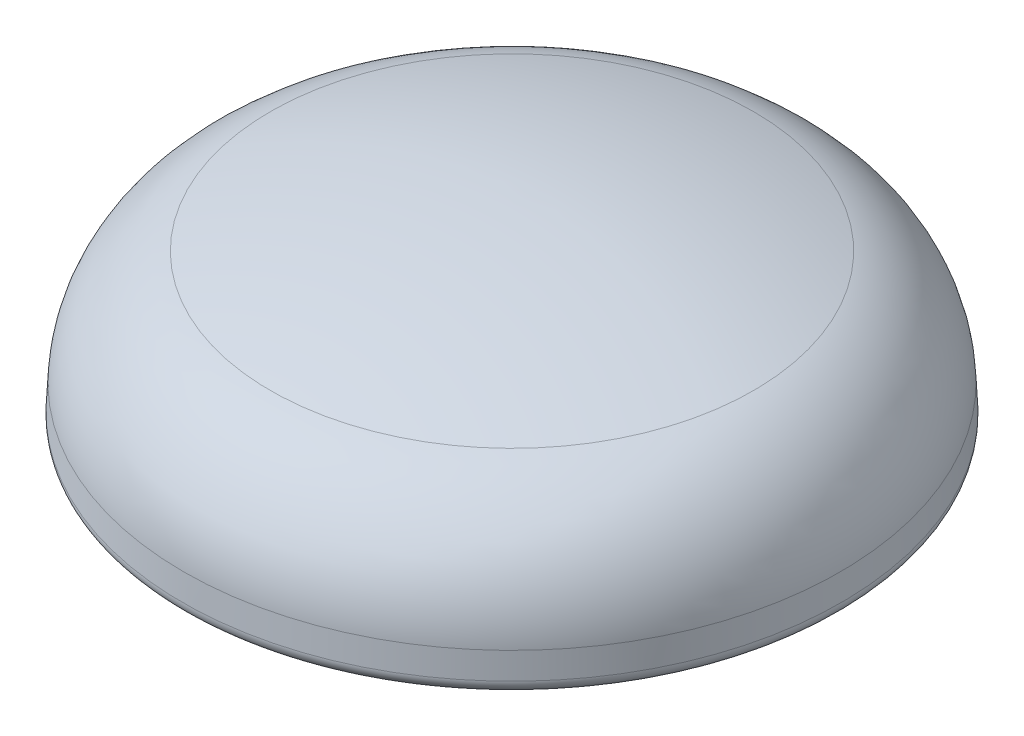
ISO-10303-21;
HEADER;
FILE_DESCRIPTION(('STEP AP214'),'2;1');
FILE_NAME('part.step','',(''),(''),'','','');
FILE_SCHEMA(('AUTOMOTIVE_DESIGN { 1 0 10303 214 1 1 1 1 }'));
ENDSEC;
DATA;
#1=APPLICATION_CONTEXT('core data for automotive mechanical design processes');
#2=APPLICATION_PROTOCOL_DEFINITION('international standard','automotive_design',2000,#1);
#3=PRODUCT_CONTEXT('',#1,'mechanical');
#4=PRODUCT('Part','Part','',(#3));
#5=PRODUCT_RELATED_PRODUCT_CATEGORY('part','',(#4));
#6=PRODUCT_DEFINITION_FORMATION('','',#4);
#7=PRODUCT_DEFINITION_CONTEXT('part definition',#1,'design');
#8=PRODUCT_DEFINITION('design','',#6,#7);
#9=PRODUCT_DEFINITION_SHAPE('','',#8);
#10=(LENGTH_UNIT() NAMED_UNIT(*) SI_UNIT(.MILLI.,.METRE.));
#11=(NAMED_UNIT(*) PLANE_ANGLE_UNIT() SI_UNIT($,.RADIAN.));
#12=(NAMED_UNIT(*) SI_UNIT($,.STERADIAN.) SOLID_ANGLE_UNIT());
#13=UNCERTAINTY_MEASURE_WITH_UNIT(LENGTH_MEASURE(1.E-05),#10,'distance_accuracy_value','');
#14=(GEOMETRIC_REPRESENTATION_CONTEXT(3) GLOBAL_UNCERTAINTY_ASSIGNED_CONTEXT((#13)) GLOBAL_UNIT_ASSIGNED_CONTEXT((#10,
#11,#12)) REPRESENTATION_CONTEXT('',''));
#15=CARTESIAN_POINT('',(0.,0.,0.));
#16=DIRECTION('',(0.,0.,1.));
#17=DIRECTION('',(1.,0.,0.));
#18=AXIS2_PLACEMENT_3D('',#15,#16,#17);
#19=CARTESIAN_POINT('',(2.149391775674E-13,12.28748487017,0.));
#20=DIRECTION('',(0.,-1.,0.));
#21=DIRECTION('',(0.,0.,-1.));
#22=AXIS2_PLACEMENT_3D('',#19,#20,#21);
#23=PLANE('',#22);
#24=CARTESIAN_POINT('',(2.14238349283136E-13,12.28748487017,0.));
#25=DIRECTION('',(0.,-1.,0.));
#26=DIRECTION('',(0.,0.,-1.));
#27=AXIS2_PLACEMENT_3D('',#24,#25,#26);
#28=CIRCLE('',#27,6.04174243050471);
#29=CARTESIAN_POINT('',(2.14238349283136E-13,12.28748487017,-6.04174243050472));
#30=VERTEX_POINT('',#29);
#31=EDGE_CURVE('E20',#30,#30,#28,.T.);
#32=ORIENTED_EDGE('',*,*,#31,.T.);
#33=EDGE_LOOP('',(#32));
#34=FACE_BOUND('',#33,.T.);
#35=ADVANCED_FACE('F16',(#34),#23,.T.);
#36=CARTESIAN_POINT('',(2.14238349283136E-13,11.78748487017,0.));
#37=DIRECTION('',(0.,-1.,0.));
#38=DIRECTION('',(0.,0.,-1.));
#39=AXIS2_PLACEMENT_3D('',#36,#37,#38);
#40=TOROIDAL_SURFACE('',#39,6.041742430505,0.50000000000001);
#41=ORIENTED_EDGE('',*,*,#31,.F.);
#42=EDGE_LOOP('',(#41));
#43=FACE_BOUND('',#42,.T.);
#44=CARTESIAN_POINT('',(2.14238349283136E-13,11.98748487017,0.));
#45=DIRECTION('',(0.,-1.,0.));
#46=DIRECTION('',(0.,0.,-1.));
#47=AXIS2_PLACEMENT_3D('',#44,#45,#46);
#48=CIRCLE('',#47,6.50000000000059);
#49=CARTESIAN_POINT('',(2.14238349283136E-13,11.98748487017,-6.50000000000059));
#50=VERTEX_POINT('',#49);
#51=EDGE_CURVE('E45',#50,#50,#48,.F.);
#52=ORIENTED_EDGE('',*,*,#51,.F.);
#53=EDGE_LOOP('',(#52));
#54=FACE_BOUND('',#53,.T.);
#55=ADVANCED_FACE('F53',(#43,#54),#40,.F.);
#56=CARTESIAN_POINT('',(2.149391775674E-13,11.98748487017,0.));
#57=DIRECTION('',(0.,-1.,0.));
#58=DIRECTION('',(0.,0.,-1.));
#59=AXIS2_PLACEMENT_3D('',#56,#57,#58);
#60=PLANE('',#59);
#61=CARTESIAN_POINT('',(2.15105711021124E-13,11.987484870172,0.));
#62=DIRECTION('',(0.,-1.,0.));
#63=DIRECTION('',(0.,0.,-1.));
#64=AXIS2_PLACEMENT_3D('',#61,#62,#63);
#65=CIRCLE('',#64,7.41267811418311);
#66=CARTESIAN_POINT('',(2.15105711021124E-13,11.987484870172,-7.41267811418311));
#67=VERTEX_POINT('',#66);
#68=EDGE_CURVE('E43',#67,#67,#65,.T.);
#69=ORIENTED_EDGE('',*,*,#68,.T.);
#70=EDGE_LOOP('',(#69));
#71=FACE_BOUND('',#70,.T.);
#72=ORIENTED_EDGE('',*,*,#51,.T.);
#73=EDGE_LOOP('',(#72));
#74=FACE_BOUND('',#73,.T.);
#75=ADVANCED_FACE('F56',(#71,#74),#60,.T.);
#76=CARTESIAN_POINT('',(2.15105711021124E-13,9.98748487017399,0.));
#77=DIRECTION('',(0.,-1.,0.));
#78=DIRECTION('',(0.,0.,-1.));
#79=AXIS2_PLACEMENT_3D('',#76,#77,#78);
#80=TOROIDAL_SURFACE('',#79,7.4126781141832,1.999999999998);
#81=CARTESIAN_POINT('',(2.15105711021124E-13,11.9798742663569,0.));
#82=DIRECTION('',(0.,-1.,0.));
#83=DIRECTION('',(0.,0.,-1.));
#84=AXIS2_PLACEMENT_3D('',#81,#82,#83);
#85=CIRCLE('',#84,7.58698959967794);
#86=CARTESIAN_POINT('',(2.15105711021124E-13,11.9798742663569,-7.58698959967794));
#87=VERTEX_POINT('',#86);
#88=EDGE_CURVE('E33',#87,#87,#85,.T.);
#89=ORIENTED_EDGE('',*,*,#88,.T.);
#90=EDGE_LOOP('',(#89));
#91=FACE_BOUND('',#90,.T.);
#92=ORIENTED_EDGE('',*,*,#68,.F.);
#93=EDGE_LOOP('',(#92));
#94=FACE_BOUND('',#93,.T.);
#95=ADVANCED_FACE('F63',(#91,#94),#80,.F.);
#96=CARTESIAN_POINT('',(2.15105711021124E-13,11.8555819694625,0.));
#97=DIRECTION('',(0.,-1.,0.));
#98=DIRECTION('',(1.,0.,0.));
#99=AXIS2_PLACEMENT_3D('',#96,#97,#98);
#100=CONICAL_SURFACE('',#99,9.00765705400704,1.4835298641949);
#101=CARTESIAN_POINT('',(2.15105711021124E-13,11.8555819694625,0.));
#102=DIRECTION('',(0.,-1.,0.));
#103=DIRECTION('',(0.,0.,-1.));
#104=AXIS2_PLACEMENT_3D('',#101,#102,#103);
#105=CIRCLE('',#104,9.00765705400043);
#106=CARTESIAN_POINT('',(2.15105711021124E-13,11.8555819694625,-9.00765705400043));
#107=VERTEX_POINT('',#106);
#108=EDGE_CURVE('E109',#107,#107,#105,.T.);
#109=ORIENTED_EDGE('',*,*,#108,.T.);
#110=EDGE_LOOP('',(#109));
#111=FACE_BOUND('',#110,.T.);
#112=ORIENTED_EDGE('',*,*,#88,.F.);
#113=EDGE_LOOP('',(#112));
#114=FACE_BOUND('',#113,.T.);
#115=ADVANCED_FACE('F95',(#111,#114),#100,.F.);
#116=CARTESIAN_POINT('',(2.15105711021124E-13,9.86319257327902,0.));
#117=DIRECTION('',(0.,-1.,0.));
#118=DIRECTION('',(0.,0.,-1.));
#119=AXIS2_PLACEMENT_3D('',#116,#117,#118);
#120=TOROIDAL_SURFACE('',#119,8.83334556850502,1.99999999999998);
#121=CARTESIAN_POINT('',(2.15105711021124E-13,11.5014966618593,0.));
#122=DIRECTION('',(0.,-1.,0.));
#123=DIRECTION('',(0.,0.,-1.));
#124=AXIS2_PLACEMENT_3D('',#121,#122,#123);
#125=CIRCLE('',#124,9.98049844120673);
#126=CARTESIAN_POINT('',(2.15105711021124E-13,11.5014966618593,-9.98049844120673));
#127=VERTEX_POINT('',#126);
#128=EDGE_CURVE('E111',#127,#127,#125,.T.);
#129=ORIENTED_EDGE('',*,*,#128,.T.);
#130=EDGE_LOOP('',(#129));
#131=FACE_BOUND('',#130,.T.);
#132=ORIENTED_EDGE('',*,*,#108,.F.);
#133=EDGE_LOOP('',(#132));
#134=FACE_BOUND('',#133,.T.);
#135=ADVANCED_FACE('F93',(#131,#134),#120,.F.);
#136=CARTESIAN_POINT('',(2.15105711021124E-13,10.5868227129341,0.));
#137=DIRECTION('',(0.,-1.,0.));
#138=DIRECTION('',(0.,0.,-1.));
#139=AXIS2_PLACEMENT_3D('',#136,#137,#138);
#140=CONICAL_SURFACE('',#139,11.2867882181827,0.9599310885967);
#141=CARTESIAN_POINT('',(2.15105711021124E-13,10.586822712931,0.));
#142=DIRECTION('',(0.,-1.,0.));
#143=DIRECTION('',(0.,0.,-1.));
#144=AXIS2_PLACEMENT_3D('',#141,#142,#143);
#145=CIRCLE('',#144,11.2867882181805);
#146=CARTESIAN_POINT('',(2.15105711021124E-13,10.586822712931,-11.2867882181805));
#147=VERTEX_POINT('',#146);
#148=EDGE_CURVE('E114',#147,#147,#145,.T.);
#149=ORIENTED_EDGE('',*,*,#148,.T.);
#150=EDGE_LOOP('',(#149));
#151=FACE_BOUND('',#150,.T.);
#152=ORIENTED_EDGE('',*,*,#128,.F.);
#153=EDGE_LOOP('',(#152));
#154=FACE_BOUND('',#153,.T.);
#155=ADVANCED_FACE('F91',(#151,#154),#140,.F.);
#156=CARTESIAN_POINT('',(2.15105711021124E-13,10.17724669079,0.));
#157=DIRECTION('',(0.,-1.,0.));
#158=DIRECTION('',(0.,0.,-1.));
#159=AXIS2_PLACEMENT_3D('',#156,#157,#158);
#160=TOROIDAL_SURFACE('',#159,11.,0.499999999999996);
#161=CARTESIAN_POINT('',(2.149391775674E-13,10.17724669079,0.));
#162=DIRECTION('',(0.,-1.,0.));
#163=DIRECTION('',(0.,0.,-1.));
#164=AXIS2_PLACEMENT_3D('',#161,#162,#163);
#165=CIRCLE('',#164,11.5);
#166=CARTESIAN_POINT('',(2.149391775674E-13,10.17724669079,-11.5));
#167=VERTEX_POINT('',#166);
#168=EDGE_CURVE('E42',#167,#167,#165,.T.);
#169=ORIENTED_EDGE('',*,*,#168,.T.);
#170=EDGE_LOOP('',(#169));
#171=FACE_BOUND('',#170,.T.);
#172=ORIENTED_EDGE('',*,*,#148,.F.);
#173=EDGE_LOOP('',(#172));
#174=FACE_BOUND('',#173,.T.);
#175=ADVANCED_FACE('F87',(#171,#174),#160,.F.);
#176=CARTESIAN_POINT('',(2.149391775674E-13,12.6001432803,0.));
#177=DIRECTION('',(0.,-1.,0.));
#178=DIRECTION('',(0.,0.,-1.));
#179=AXIS2_PLACEMENT_3D('',#176,#177,#178);
#180=CYLINDRICAL_SURFACE('',#179,11.5);
#181=ORIENTED_EDGE('',*,*,#168,.F.);
#182=EDGE_LOOP('',(#181));
#183=FACE_BOUND('',#182,.T.);
#184=CARTESIAN_POINT('',(2.149391775674E-13,9.187484870172,0.));
#185=DIRECTION('',(0.,-1.,0.));
#186=DIRECTION('',(0.,0.,-1.));
#187=AXIS2_PLACEMENT_3D('',#184,#185,#186);
#188=CIRCLE('',#187,11.5);
#189=CARTESIAN_POINT('',(2.149391775674E-13,9.187484870172,-11.5));
#190=VERTEX_POINT('',#189);
#191=EDGE_CURVE('E39',#190,#190,#188,.T.);
#192=ORIENTED_EDGE('',*,*,#191,.T.);
#193=EDGE_LOOP('',(#192));
#194=FACE_BOUND('',#193,.T.);
#195=ADVANCED_FACE('F90',(#183,#194),#180,.F.);
#196=CARTESIAN_POINT('',(2.149391775674E-13,9.187484870172,0.));
#197=DIRECTION('',(0.,-1.,0.));
#198=DIRECTION('',(0.,0.,-1.));
#199=AXIS2_PLACEMENT_3D('',#196,#197,#198);
#200=PLANE('',#199);
#201=ORIENTED_EDGE('',*,*,#191,.F.);
#202=EDGE_LOOP('',(#201));
#203=FACE_BOUND('',#202,.T.);
#204=CARTESIAN_POINT('',(2.15105711021124E-13,9.18748487017207,0.));
#205=DIRECTION('',(0.,1.,0.));
#206=DIRECTION('',(0.,0.,1.));
#207=AXIS2_PLACEMENT_3D('',#204,#205,#206);
#208=CIRCLE('',#207,10.490400445433);
#209=CARTESIAN_POINT('',(2.15105711021124E-13,9.18748487017207,10.490400445433));
#210=VERTEX_POINT('',#209);
#211=EDGE_CURVE('E35',#210,#210,#208,.F.);
#212=ORIENTED_EDGE('',*,*,#211,.T.);
#213=EDGE_LOOP('',(#212));
#214=FACE_BOUND('',#213,.T.);
#215=ADVANCED_FACE('F140',(#203,#214),#200,.F.);
#216=CARTESIAN_POINT('',(2.15105711021124E-13,9.18748487017206,0.));
#217=DIRECTION('',(0.,1.,0.));
#218=DIRECTION('',(0.,0.,1.));
#219=AXIS2_PLACEMENT_3D('',#216,#217,#218);
#220=CONICAL_SURFACE('',#219,10.490400445433,0.00872664625996936);
#221=CARTESIAN_POINT('',(0.,7.01169978424233,0.));
#222=DIRECTION('',(0.,1.,0.));
#223=DIRECTION('',(0.,0.,1.));
#224=AXIS2_PLACEMENT_3D('',#221,#222,#223);
#225=CIRCLE('',#224,10.47141265664);
#226=CARTESIAN_POINT('',(0.,7.01169978424233,10.47141265664));
#227=VERTEX_POINT('',#226);
#228=EDGE_CURVE('E38',#227,#227,#225,.T.);
#229=ORIENTED_EDGE('',*,*,#228,.F.);
#230=EDGE_LOOP('',(#229));
#231=FACE_BOUND('',#230,.T.);
#232=ORIENTED_EDGE('',*,*,#211,.F.);
#233=EDGE_LOOP('',(#232));
#234=FACE_BOUND('',#233,.T.);
#235=ADVANCED_FACE('F134',(#231,#234),#220,.F.);
#236=CARTESIAN_POINT('',(0.,7.0822430063496,0.));
#237=DIRECTION('',(0.,1.,0.));
#238=DIRECTION('',(-1.,0.,0.));
#239=AXIS2_PLACEMENT_3D('',#236,#237,#238);
#240=CONICAL_SURFACE('',#239,12.49150623228,1.53588974175472);
#241=CARTESIAN_POINT('',(0.,7.0822430063495,0.));
#242=DIRECTION('',(0.,1.,0.));
#243=DIRECTION('',(0.,0.,1.));
#244=AXIS2_PLACEMENT_3D('',#241,#242,#243);
#245=CIRCLE('',#244,12.4915062322786);
#246=CARTESIAN_POINT('',(0.,7.0822430063495,12.4915062322786));
#247=VERTEX_POINT('',#246);
#248=EDGE_CURVE('E123',#247,#247,#245,.T.);
#249=ORIENTED_EDGE('',*,*,#248,.F.);
#250=EDGE_LOOP('',(#249));
#251=FACE_BOUND('',#250,.T.);
#252=ORIENTED_EDGE('',*,*,#228,.T.);
#253=EDGE_LOOP('',(#252));
#254=FACE_BOUND('',#253,.T.);
#255=ADVANCED_FACE('F85',(#251,#254),#240,.T.);
#256=CARTESIAN_POINT('',(0.,7.5819384205819,0.));
#257=DIRECTION('',(0.,-1.,0.));
#258=DIRECTION('',(0.,0.,-1.));
#259=AXIS2_PLACEMENT_3D('',#256,#257,#258);
#260=TOROIDAL_SURFACE('',#259,12.4740565046301,0.499999999999876);
#261=ORIENTED_EDGE('',*,*,#248,.T.);
#262=EDGE_LOOP('',(#261));
#263=FACE_BOUND('',#262,.T.);
#264=CARTESIAN_POINT('',(0.,7.6081063998619,0.));
#265=DIRECTION('',(0.,-1.,0.));
#266=DIRECTION('',(0.,0.,-1.));
#267=AXIS2_PLACEMENT_3D('',#264,#265,#266);
#268=CIRCLE('',#267,12.9733712719408);
#269=CARTESIAN_POINT('',(0.,7.60810639986189,-12.9733712719408));
#270=VERTEX_POINT('',#269);
#271=EDGE_CURVE('E29',#270,#270,#268,.F.);
#272=ORIENTED_EDGE('',*,*,#271,.F.);
#273=EDGE_LOOP('',(#272));
#274=FACE_BOUND('',#273,.T.);
#275=ADVANCED_FACE('F78',(#263,#274),#260,.T.);
#276=CARTESIAN_POINT('',(0.,7.60810639986189,0.));
#277=DIRECTION('',(0.,-1.,0.));
#278=DIRECTION('',(0.,0.,-1.));
#279=AXIS2_PLACEMENT_3D('',#276,#277,#278);
#280=CONICAL_SURFACE('',#279,12.9733712719408,0.0523598775598193);
#281=CARTESIAN_POINT('',(0.,8.62161355860584,0.));
#282=DIRECTION('',(0.,1.,0.));
#283=DIRECTION('',(0.,0.,1.));
#284=AXIS2_PLACEMENT_3D('',#281,#282,#283);
#285=CIRCLE('',#284,12.9202556124669);
#286=CARTESIAN_POINT('',(0.,8.62161355860584,12.9202556124669));
#287=VERTEX_POINT('',#286);
#288=EDGE_CURVE('E24',#287,#287,#285,.T.);
#289=ORIENTED_EDGE('',*,*,#288,.F.);
#290=EDGE_LOOP('',(#289));
#291=FACE_BOUND('',#290,.T.);
#292=ORIENTED_EDGE('',*,*,#271,.T.);
#293=EDGE_LOOP('',(#292));
#294=FACE_BOUND('',#293,.T.);
#295=ADVANCED_FACE('F73',(#291,#294),#280,.T.);
#296=CARTESIAN_POINT('',(0.,8.35993377739201,0.));
#297=DIRECTION('',(0.,-1.,0.));
#298=DIRECTION('',(0.,0.,-1.));
#299=AXIS2_PLACEMENT_3D('',#296,#297,#298);
#300=TOROIDAL_SURFACE('',#299,7.92710793869401,4.99999999999999);
#301=CARTESIAN_POINT('',(0.,13.1019205328705,0.));
#302=DIRECTION('',(0.,-1.,0.));
#303=DIRECTION('',(0.,0.,-1.));
#304=AXIS2_PLACEMENT_3D('',#301,#302,#303);
#305=CIRCLE('',#304,9.51252952643217);
#306=CARTESIAN_POINT('',(0.,13.1019205328705,-9.51252952643217));
#307=VERTEX_POINT('',#306);
#308=EDGE_CURVE('E10',#307,#307,#305,.F.);
#309=ORIENTED_EDGE('',*,*,#308,.F.);
#310=EDGE_LOOP('',(#309));
#311=FACE_BOUND('',#310,.T.);
#312=ORIENTED_EDGE('',*,*,#288,.T.);
#313=EDGE_LOOP('',(#312));
#314=FACE_BOUND('',#313,.T.);
#315=ADVANCED_FACE('F69',(#311,#314),#300,.T.);
#316=CARTESIAN_POINT('',(0.,-15.35,0.));
#317=DIRECTION('',(-1.,0.,0.));
#318=DIRECTION('',(0.,0.946404832092135,0.322982807271004));
#319=AXIS2_PLACEMENT_3D('',#316,#317,#318);
#320=SPHERICAL_SURFACE('',#319,30.);
#321=CARTESIAN_POINT('',(0.,-15.35,0.));
#322=DIRECTION('',(0.,-1.,0.));
#323=DIRECTION('',(0.,0.,-1.));
#324=AXIS2_PLACEMENT_3D('',#321,#322,#323);
#325=SPHERICAL_SURFACE('',#324,30.);
#326=ORIENTED_EDGE('',*,*,#308,.T.);
#327=EDGE_LOOP('',(#326));
#328=FACE_BOUND('',#327,.T.);
#329=ADVANCED_FACE('F18',(#328),#325,.T.);
#330=CLOSED_SHELL('',(#35,#55,#75,#95,#115,#135,#155,#175,#195,#215,#235,#255,#275,#295,#315,#329));
#331=MANIFOLD_SOLID_BREP('B1',#330);
#332=ADVANCED_BREP_SHAPE_REPRESENTATION('',(#18,#331),#14);
#333=SHAPE_DEFINITION_REPRESENTATION(#9,#332);
ENDSEC;
END-ISO-10303-21;
